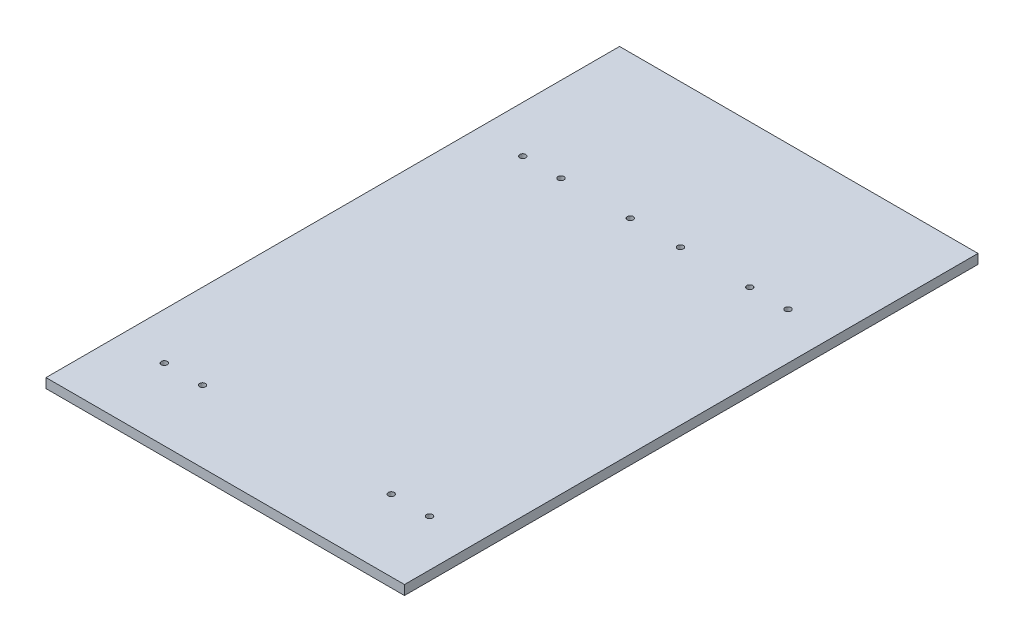
ISO-10303-21;
HEADER;
FILE_DESCRIPTION(('STEP AP214'),'2;1');
FILE_NAME('part.step','',(''),(''),'','','');
FILE_SCHEMA(('AUTOMOTIVE_DESIGN { 1 0 10303 214 1 1 1 1 }'));
ENDSEC;
DATA;
#1=APPLICATION_CONTEXT('core data for automotive mechanical design processes');
#2=APPLICATION_PROTOCOL_DEFINITION('international standard','automotive_design',2000,#1);
#3=PRODUCT_CONTEXT('',#1,'mechanical');
#4=PRODUCT('Part','Part','',(#3));
#5=PRODUCT_RELATED_PRODUCT_CATEGORY('part','',(#4));
#6=PRODUCT_DEFINITION_FORMATION('','',#4);
#7=PRODUCT_DEFINITION_CONTEXT('part definition',#1,'design');
#8=PRODUCT_DEFINITION('design','',#6,#7);
#9=PRODUCT_DEFINITION_SHAPE('','',#8);
#10=(LENGTH_UNIT() NAMED_UNIT(*) SI_UNIT(.MILLI.,.METRE.));
#11=(NAMED_UNIT(*) PLANE_ANGLE_UNIT() SI_UNIT($,.RADIAN.));
#12=(NAMED_UNIT(*) SI_UNIT($,.STERADIAN.) SOLID_ANGLE_UNIT());
#13=UNCERTAINTY_MEASURE_WITH_UNIT(LENGTH_MEASURE(1.E-05),#10,'distance_accuracy_value','');
#14=(GEOMETRIC_REPRESENTATION_CONTEXT(3) GLOBAL_UNCERTAINTY_ASSIGNED_CONTEXT((#13)) GLOBAL_UNIT_ASSIGNED_CONTEXT((#10,
#11,#12)) REPRESENTATION_CONTEXT('',''));
#15=CARTESIAN_POINT('',(0.,0.,0.));
#16=DIRECTION('',(0.,0.,1.));
#17=DIRECTION('',(1.,0.,0.));
#18=AXIS2_PLACEMENT_3D('',#15,#16,#17);
#19=CARTESIAN_POINT('',(0.,8.,0.));
#20=DIRECTION('',(0.,-1.,0.));
#21=DIRECTION('',(0.,0.,-1.));
#22=AXIS2_PLACEMENT_3D('',#19,#20,#21);
#23=PLANE('',#22);
#24=DIRECTION('',(0.,0.,-1.));
#25=VECTOR('',#24,1.);
#26=CARTESIAN_POINT('',(150.,8.,240.));
#27=LINE('',#26,#25);
#28=CARTESIAN_POINT('',(150.,8.,240.));
#29=VERTEX_POINT('',#28);
#30=CARTESIAN_POINT('',(150.,8.,-240.));
#31=VERTEX_POINT('',#30);
#32=EDGE_CURVE('E89',#29,#31,#27,.T.);
#33=ORIENTED_EDGE('',*,*,#32,.T.);
#34=DIRECTION('',(-1.,0.,0.));
#35=VECTOR('',#34,1.);
#36=CARTESIAN_POINT('',(-150.,8.,-240.));
#37=LINE('',#36,#35);
#38=CARTESIAN_POINT('',(-150.,8.,-240.));
#39=VERTEX_POINT('',#38);
#40=EDGE_CURVE('E84',#31,#39,#37,.T.);
#41=ORIENTED_EDGE('',*,*,#40,.T.);
#42=DIRECTION('',(0.,0.,1.));
#43=VECTOR('',#42,1.);
#44=CARTESIAN_POINT('',(-150.,8.,240.));
#45=LINE('',#44,#43);
#46=CARTESIAN_POINT('',(-150.,8.,240.));
#47=VERTEX_POINT('',#46);
#48=EDGE_CURVE('E87',#39,#47,#45,.T.);
#49=ORIENTED_EDGE('',*,*,#48,.T.);
#50=DIRECTION('',(1.,0.,0.));
#51=VECTOR('',#50,1.);
#52=CARTESIAN_POINT('',(-150.,8.,240.));
#53=LINE('',#52,#51);
#54=EDGE_CURVE('E54',#47,#29,#53,.T.);
#55=ORIENTED_EDGE('',*,*,#54,.T.);
#56=EDGE_LOOP('',(#33,#41,#49,#55));
#57=FACE_BOUND('',#56,.T.);
#58=CARTESIAN_POINT('',(-111.,8.,-120.));
#59=DIRECTION('',(0.,1.,0.));
#60=DIRECTION('',(0.,0.,1.));
#61=AXIS2_PLACEMENT_3D('',#58,#59,#60);
#62=CIRCLE('',#61,2.5);
#63=CARTESIAN_POINT('',(-111.,8.,-117.5));
#64=VERTEX_POINT('',#63);
#65=EDGE_CURVE('E104',#64,#64,#62,.T.);
#66=ORIENTED_EDGE('',*,*,#65,.F.);
#67=EDGE_LOOP('',(#66));
#68=FACE_BOUND('',#67,.T.);
#69=CARTESIAN_POINT('',(-111.,8.,180.));
#70=DIRECTION('',(0.,1.,0.));
#71=DIRECTION('',(0.,0.,1.));
#72=AXIS2_PLACEMENT_3D('',#69,#70,#71);
#73=CIRCLE('',#72,2.50000000000001);
#74=CARTESIAN_POINT('',(-111.,8.,182.5));
#75=VERTEX_POINT('',#74);
#76=EDGE_CURVE('E119',#75,#75,#73,.T.);
#77=ORIENTED_EDGE('',*,*,#76,.F.);
#78=EDGE_LOOP('',(#77));
#79=FACE_BOUND('',#78,.T.);
#80=CARTESIAN_POINT('',(-79.,8.,180.));
#81=DIRECTION('',(0.,1.,0.));
#82=DIRECTION('',(0.,0.,-1.));
#83=AXIS2_PLACEMENT_3D('',#80,#81,#82);
#84=CIRCLE('',#83,2.5);
#85=CARTESIAN_POINT('',(-79.,8.,177.5));
#86=VERTEX_POINT('',#85);
#87=EDGE_CURVE('E125',#86,#86,#84,.T.);
#88=ORIENTED_EDGE('',*,*,#87,.F.);
#89=EDGE_LOOP('',(#88));
#90=FACE_BOUND('',#89,.T.);
#91=CARTESIAN_POINT('',(-79.,8.,-120.));
#92=DIRECTION('',(0.,1.,0.));
#93=DIRECTION('',(0.,0.,-1.));
#94=AXIS2_PLACEMENT_3D('',#91,#92,#93);
#95=CIRCLE('',#94,2.5);
#96=CARTESIAN_POINT('',(-79.,8.,-122.5));
#97=VERTEX_POINT('',#96);
#98=EDGE_CURVE('E131',#97,#97,#95,.T.);
#99=ORIENTED_EDGE('',*,*,#98,.F.);
#100=EDGE_LOOP('',(#99));
#101=FACE_BOUND('',#100,.T.);
#102=CARTESIAN_POINT('',(79.0000000000001,8.,180.));
#103=DIRECTION('',(0.,1.,0.));
#104=DIRECTION('',(0.,0.,1.));
#105=AXIS2_PLACEMENT_3D('',#102,#103,#104);
#106=CIRCLE('',#105,2.5);
#107=CARTESIAN_POINT('',(79.0000000000001,8.,182.5));
#108=VERTEX_POINT('',#107);
#109=EDGE_CURVE('E137',#108,#108,#106,.T.);
#110=ORIENTED_EDGE('',*,*,#109,.F.);
#111=EDGE_LOOP('',(#110));
#112=FACE_BOUND('',#111,.T.);
#113=CARTESIAN_POINT('',(111.,8.,180.));
#114=DIRECTION('',(0.,1.,0.));
#115=DIRECTION('',(0.,0.,-1.));
#116=AXIS2_PLACEMENT_3D('',#113,#114,#115);
#117=CIRCLE('',#116,2.50000000000001);
#118=CARTESIAN_POINT('',(111.,8.,177.5));
#119=VERTEX_POINT('',#118);
#120=EDGE_CURVE('E143',#119,#119,#117,.T.);
#121=ORIENTED_EDGE('',*,*,#120,.F.);
#122=EDGE_LOOP('',(#121));
#123=FACE_BOUND('',#122,.T.);
#124=CARTESIAN_POINT('',(79.,8.,-120.));
#125=DIRECTION('',(0.,1.,0.));
#126=DIRECTION('',(0.,0.,1.));
#127=AXIS2_PLACEMENT_3D('',#124,#125,#126);
#128=CIRCLE('',#127,2.5);
#129=CARTESIAN_POINT('',(79.,8.,-117.5));
#130=VERTEX_POINT('',#129);
#131=EDGE_CURVE('E149',#130,#130,#128,.T.);
#132=ORIENTED_EDGE('',*,*,#131,.F.);
#133=EDGE_LOOP('',(#132));
#134=FACE_BOUND('',#133,.T.);
#135=CARTESIAN_POINT('',(111.,8.,-120.));
#136=DIRECTION('',(0.,1.,0.));
#137=DIRECTION('',(0.,0.,-1.));
#138=AXIS2_PLACEMENT_3D('',#135,#136,#137);
#139=CIRCLE('',#138,2.5);
#140=CARTESIAN_POINT('',(111.,8.,-122.5));
#141=VERTEX_POINT('',#140);
#142=EDGE_CURVE('E155',#141,#141,#139,.T.);
#143=ORIENTED_EDGE('',*,*,#142,.F.);
#144=EDGE_LOOP('',(#143));
#145=FACE_BOUND('',#144,.T.);
#146=CARTESIAN_POINT('',(-21.,8.,-120.));
#147=DIRECTION('',(0.,1.,0.));
#148=DIRECTION('',(0.,0.,1.));
#149=AXIS2_PLACEMENT_3D('',#146,#147,#148);
#150=CIRCLE('',#149,2.5);
#151=CARTESIAN_POINT('',(-21.,8.,-117.5));
#152=VERTEX_POINT('',#151);
#153=EDGE_CURVE('E161',#152,#152,#150,.T.);
#154=ORIENTED_EDGE('',*,*,#153,.F.);
#155=EDGE_LOOP('',(#154));
#156=FACE_BOUND('',#155,.T.);
#157=CARTESIAN_POINT('',(21.,8.,-120.));
#158=DIRECTION('',(0.,1.,0.));
#159=DIRECTION('',(0.,0.,-1.));
#160=AXIS2_PLACEMENT_3D('',#157,#158,#159);
#161=CIRCLE('',#160,2.5);
#162=CARTESIAN_POINT('',(21.,8.,-122.5));
#163=VERTEX_POINT('',#162);
#164=EDGE_CURVE('E167',#163,#163,#161,.T.);
#165=ORIENTED_EDGE('',*,*,#164,.F.);
#166=EDGE_LOOP('',(#165));
#167=FACE_BOUND('',#166,.T.);
#168=ADVANCED_FACE('F37',(#57,#68,#79,#90,#101,#112,#123,#134,#145,#156,#167),#23,.F.);
#169=CARTESIAN_POINT('',(0.,0.,0.));
#170=DIRECTION('',(0.,-1.,0.));
#171=DIRECTION('',(0.,0.,-1.));
#172=AXIS2_PLACEMENT_3D('',#169,#170,#171);
#173=PLANE('',#172);
#174=CARTESIAN_POINT('',(-21.,0.,-120.));
#175=DIRECTION('',(0.,1.,0.));
#176=DIRECTION('',(0.,0.,1.));
#177=AXIS2_PLACEMENT_3D('',#174,#175,#176);
#178=CIRCLE('',#177,2.5);
#179=CARTESIAN_POINT('',(-21.,0.,-117.5));
#180=VERTEX_POINT('',#179);
#181=EDGE_CURVE('E164',#180,#180,#178,.T.);
#182=ORIENTED_EDGE('',*,*,#181,.T.);
#183=EDGE_LOOP('',(#182));
#184=FACE_BOUND('',#183,.T.);
#185=CARTESIAN_POINT('',(79.,0.,-120.));
#186=DIRECTION('',(0.,1.,0.));
#187=DIRECTION('',(0.,0.,1.));
#188=AXIS2_PLACEMENT_3D('',#185,#186,#187);
#189=CIRCLE('',#188,2.5);
#190=CARTESIAN_POINT('',(79.,0.,-117.5));
#191=VERTEX_POINT('',#190);
#192=EDGE_CURVE('E152',#191,#191,#189,.T.);
#193=ORIENTED_EDGE('',*,*,#192,.T.);
#194=EDGE_LOOP('',(#193));
#195=FACE_BOUND('',#194,.T.);
#196=CARTESIAN_POINT('',(79.0000000000001,0.,180.));
#197=DIRECTION('',(0.,1.,0.));
#198=DIRECTION('',(0.,0.,1.));
#199=AXIS2_PLACEMENT_3D('',#196,#197,#198);
#200=CIRCLE('',#199,2.5);
#201=CARTESIAN_POINT('',(79.0000000000001,0.,182.5));
#202=VERTEX_POINT('',#201);
#203=EDGE_CURVE('E140',#202,#202,#200,.T.);
#204=ORIENTED_EDGE('',*,*,#203,.T.);
#205=EDGE_LOOP('',(#204));
#206=FACE_BOUND('',#205,.T.);
#207=CARTESIAN_POINT('',(-79.,0.,180.));
#208=DIRECTION('',(0.,1.,0.));
#209=DIRECTION('',(0.,0.,-1.));
#210=AXIS2_PLACEMENT_3D('',#207,#208,#209);
#211=CIRCLE('',#210,2.5);
#212=CARTESIAN_POINT('',(-79.,0.,177.5));
#213=VERTEX_POINT('',#212);
#214=EDGE_CURVE('E128',#213,#213,#211,.T.);
#215=ORIENTED_EDGE('',*,*,#214,.T.);
#216=EDGE_LOOP('',(#215));
#217=FACE_BOUND('',#216,.T.);
#218=CARTESIAN_POINT('',(-111.,0.,-120.));
#219=DIRECTION('',(0.,1.,0.));
#220=DIRECTION('',(0.,0.,1.));
#221=AXIS2_PLACEMENT_3D('',#218,#219,#220);
#222=CIRCLE('',#221,2.5);
#223=CARTESIAN_POINT('',(-111.,0.,-117.5));
#224=VERTEX_POINT('',#223);
#225=EDGE_CURVE('E116',#224,#224,#222,.T.);
#226=ORIENTED_EDGE('',*,*,#225,.T.);
#227=EDGE_LOOP('',(#226));
#228=FACE_BOUND('',#227,.T.);
#229=DIRECTION('',(0.,0.,-1.));
#230=VECTOR('',#229,1.);
#231=CARTESIAN_POINT('',(150.,0.,240.));
#232=LINE('',#231,#230);
#233=CARTESIAN_POINT('',(150.,0.,240.));
#234=VERTEX_POINT('',#233);
#235=CARTESIAN_POINT('',(150.,0.,-240.));
#236=VERTEX_POINT('',#235);
#237=EDGE_CURVE('E101',#234,#236,#232,.T.);
#238=ORIENTED_EDGE('',*,*,#237,.F.);
#239=DIRECTION('',(1.,0.,0.));
#240=VECTOR('',#239,1.);
#241=CARTESIAN_POINT('',(-150.,0.,240.));
#242=LINE('',#241,#240);
#243=CARTESIAN_POINT('',(-150.,0.,240.));
#244=VERTEX_POINT('',#243);
#245=EDGE_CURVE('E77',#244,#234,#242,.T.);
#246=ORIENTED_EDGE('',*,*,#245,.F.);
#247=DIRECTION('',(0.,0.,1.));
#248=VECTOR('',#247,1.);
#249=CARTESIAN_POINT('',(-150.,0.,240.));
#250=LINE('',#249,#248);
#251=CARTESIAN_POINT('',(-150.,0.,-240.));
#252=VERTEX_POINT('',#251);
#253=EDGE_CURVE('E71',#252,#244,#250,.T.);
#254=ORIENTED_EDGE('',*,*,#253,.F.);
#255=DIRECTION('',(-1.,0.,0.));
#256=VECTOR('',#255,1.);
#257=CARTESIAN_POINT('',(-150.,0.,-240.));
#258=LINE('',#257,#256);
#259=EDGE_CURVE('E93',#236,#252,#258,.T.);
#260=ORIENTED_EDGE('',*,*,#259,.F.);
#261=EDGE_LOOP('',(#238,#246,#254,#260));
#262=FACE_BOUND('',#261,.T.);
#263=CARTESIAN_POINT('',(-111.,0.,180.));
#264=DIRECTION('',(0.,1.,0.));
#265=DIRECTION('',(0.,0.,1.));
#266=AXIS2_PLACEMENT_3D('',#263,#264,#265);
#267=CIRCLE('',#266,2.50000000000001);
#268=CARTESIAN_POINT('',(-111.,0.,182.5));
#269=VERTEX_POINT('',#268);
#270=EDGE_CURVE('E122',#269,#269,#267,.T.);
#271=ORIENTED_EDGE('',*,*,#270,.T.);
#272=EDGE_LOOP('',(#271));
#273=FACE_BOUND('',#272,.T.);
#274=CARTESIAN_POINT('',(-79.,0.,-120.));
#275=DIRECTION('',(0.,1.,0.));
#276=DIRECTION('',(0.,0.,-1.));
#277=AXIS2_PLACEMENT_3D('',#274,#275,#276);
#278=CIRCLE('',#277,2.5);
#279=CARTESIAN_POINT('',(-79.,0.,-122.5));
#280=VERTEX_POINT('',#279);
#281=EDGE_CURVE('E134',#280,#280,#278,.T.);
#282=ORIENTED_EDGE('',*,*,#281,.T.);
#283=EDGE_LOOP('',(#282));
#284=FACE_BOUND('',#283,.T.);
#285=CARTESIAN_POINT('',(111.,0.,180.));
#286=DIRECTION('',(0.,1.,0.));
#287=DIRECTION('',(0.,0.,-1.));
#288=AXIS2_PLACEMENT_3D('',#285,#286,#287);
#289=CIRCLE('',#288,2.50000000000001);
#290=CARTESIAN_POINT('',(111.,0.,177.5));
#291=VERTEX_POINT('',#290);
#292=EDGE_CURVE('E146',#291,#291,#289,.T.);
#293=ORIENTED_EDGE('',*,*,#292,.T.);
#294=EDGE_LOOP('',(#293));
#295=FACE_BOUND('',#294,.T.);
#296=CARTESIAN_POINT('',(111.,0.,-120.));
#297=DIRECTION('',(0.,1.,0.));
#298=DIRECTION('',(0.,0.,-1.));
#299=AXIS2_PLACEMENT_3D('',#296,#297,#298);
#300=CIRCLE('',#299,2.5);
#301=CARTESIAN_POINT('',(111.,0.,-122.5));
#302=VERTEX_POINT('',#301);
#303=EDGE_CURVE('E158',#302,#302,#300,.T.);
#304=ORIENTED_EDGE('',*,*,#303,.T.);
#305=EDGE_LOOP('',(#304));
#306=FACE_BOUND('',#305,.T.);
#307=CARTESIAN_POINT('',(21.,0.,-120.));
#308=DIRECTION('',(0.,1.,0.));
#309=DIRECTION('',(0.,0.,-1.));
#310=AXIS2_PLACEMENT_3D('',#307,#308,#309);
#311=CIRCLE('',#310,2.5);
#312=CARTESIAN_POINT('',(21.,0.,-122.5));
#313=VERTEX_POINT('',#312);
#314=EDGE_CURVE('E170',#313,#313,#311,.T.);
#315=ORIENTED_EDGE('',*,*,#314,.T.);
#316=EDGE_LOOP('',(#315));
#317=FACE_BOUND('',#316,.T.);
#318=ADVANCED_FACE('F112',(#184,#195,#206,#217,#228,#262,#273,#284,#295,#306,#317),#173,.T.);
#319=CARTESIAN_POINT('',(150.,8.,240.));
#320=DIRECTION('',(-1.,0.,0.));
#321=DIRECTION('',(0.,0.,1.));
#322=AXIS2_PLACEMENT_3D('',#319,#320,#321);
#323=PLANE('',#322);
#324=ORIENTED_EDGE('',*,*,#237,.T.);
#325=DIRECTION('',(0.,-1.,0.));
#326=VECTOR('',#325,1.);
#327=CARTESIAN_POINT('',(150.,8.,-240.));
#328=LINE('',#327,#326);
#329=EDGE_CURVE('E11',#31,#236,#328,.T.);
#330=ORIENTED_EDGE('',*,*,#329,.F.);
#331=ORIENTED_EDGE('',*,*,#32,.F.);
#332=DIRECTION('',(0.,-1.,0.));
#333=VECTOR('',#332,1.);
#334=CARTESIAN_POINT('',(150.,8.,240.));
#335=LINE('',#334,#333);
#336=EDGE_CURVE('E97',#29,#234,#335,.T.);
#337=ORIENTED_EDGE('',*,*,#336,.T.);
#338=EDGE_LOOP('',(#324,#330,#331,#337));
#339=FACE_BOUND('',#338,.T.);
#340=ADVANCED_FACE('F39',(#339),#323,.F.);
#341=CARTESIAN_POINT('',(-150.,8.,-240.));
#342=DIRECTION('',(0.,0.,1.));
#343=DIRECTION('',(1.,0.,0.));
#344=AXIS2_PLACEMENT_3D('',#341,#342,#343);
#345=PLANE('',#344);
#346=ORIENTED_EDGE('',*,*,#259,.T.);
#347=DIRECTION('',(0.,-1.,0.));
#348=VECTOR('',#347,1.);
#349=CARTESIAN_POINT('',(-150.,8.,-240.));
#350=LINE('',#349,#348);
#351=EDGE_CURVE('E46',#39,#252,#350,.T.);
#352=ORIENTED_EDGE('',*,*,#351,.F.);
#353=ORIENTED_EDGE('',*,*,#40,.F.);
#354=ORIENTED_EDGE('',*,*,#329,.T.);
#355=EDGE_LOOP('',(#346,#352,#353,#354));
#356=FACE_BOUND('',#355,.T.);
#357=ADVANCED_FACE('F92',(#356),#345,.F.);
#358=CARTESIAN_POINT('',(-150.,8.,240.));
#359=DIRECTION('',(1.,0.,0.));
#360=DIRECTION('',(0.,0.,-1.));
#361=AXIS2_PLACEMENT_3D('',#358,#359,#360);
#362=PLANE('',#361);
#363=ORIENTED_EDGE('',*,*,#253,.T.);
#364=DIRECTION('',(0.,-1.,0.));
#365=VECTOR('',#364,1.);
#366=CARTESIAN_POINT('',(-150.,8.,240.));
#367=LINE('',#366,#365);
#368=EDGE_CURVE('E94',#47,#244,#367,.T.);
#369=ORIENTED_EDGE('',*,*,#368,.F.);
#370=ORIENTED_EDGE('',*,*,#48,.F.);
#371=ORIENTED_EDGE('',*,*,#351,.T.);
#372=EDGE_LOOP('',(#363,#369,#370,#371));
#373=FACE_BOUND('',#372,.T.);
#374=ADVANCED_FACE('F95',(#373),#362,.F.);
#375=CARTESIAN_POINT('',(-150.,8.,240.));
#376=DIRECTION('',(0.,0.,-1.));
#377=DIRECTION('',(-1.,0.,0.));
#378=AXIS2_PLACEMENT_3D('',#375,#376,#377);
#379=PLANE('',#378);
#380=ORIENTED_EDGE('',*,*,#245,.T.);
#381=ORIENTED_EDGE('',*,*,#336,.F.);
#382=ORIENTED_EDGE('',*,*,#54,.F.);
#383=ORIENTED_EDGE('',*,*,#368,.T.);
#384=EDGE_LOOP('',(#380,#381,#382,#383));
#385=FACE_BOUND('',#384,.T.);
#386=ADVANCED_FACE('F109',(#385),#379,.F.);
#387=CARTESIAN_POINT('',(-111.,8.,-120.));
#388=DIRECTION('',(0.,-1.,0.));
#389=DIRECTION('',(0.,0.,-1.));
#390=AXIS2_PLACEMENT_3D('',#387,#388,#389);
#391=CYLINDRICAL_SURFACE('',#390,2.5);
#392=ORIENTED_EDGE('',*,*,#65,.T.);
#393=EDGE_LOOP('',(#392));
#394=FACE_BOUND('',#393,.T.);
#395=ORIENTED_EDGE('',*,*,#225,.F.);
#396=EDGE_LOOP('',(#395));
#397=FACE_BOUND('',#396,.T.);
#398=ADVANCED_FACE('F187',(#394,#397),#391,.F.);
#399=CARTESIAN_POINT('',(-111.,8.,180.));
#400=DIRECTION('',(0.,-1.,0.));
#401=DIRECTION('',(0.,0.,-1.));
#402=AXIS2_PLACEMENT_3D('',#399,#400,#401);
#403=CYLINDRICAL_SURFACE('',#402,2.50000000000001);
#404=ORIENTED_EDGE('',*,*,#76,.T.);
#405=EDGE_LOOP('',(#404));
#406=FACE_BOUND('',#405,.T.);
#407=ORIENTED_EDGE('',*,*,#270,.F.);
#408=EDGE_LOOP('',(#407));
#409=FACE_BOUND('',#408,.T.);
#410=ADVANCED_FACE('F241',(#406,#409),#403,.F.);
#411=CARTESIAN_POINT('',(-79.,8.,180.));
#412=DIRECTION('',(0.,-1.,0.));
#413=DIRECTION('',(0.,0.,-1.));
#414=AXIS2_PLACEMENT_3D('',#411,#412,#413);
#415=CYLINDRICAL_SURFACE('',#414,2.5);
#416=ORIENTED_EDGE('',*,*,#87,.T.);
#417=EDGE_LOOP('',(#416));
#418=FACE_BOUND('',#417,.T.);
#419=ORIENTED_EDGE('',*,*,#214,.F.);
#420=EDGE_LOOP('',(#419));
#421=FACE_BOUND('',#420,.T.);
#422=ADVANCED_FACE('F250',(#418,#421),#415,.F.);
#423=CARTESIAN_POINT('',(-79.,8.,-120.));
#424=DIRECTION('',(0.,-1.,0.));
#425=DIRECTION('',(0.,0.,-1.));
#426=AXIS2_PLACEMENT_3D('',#423,#424,#425);
#427=CYLINDRICAL_SURFACE('',#426,2.5);
#428=ORIENTED_EDGE('',*,*,#98,.T.);
#429=EDGE_LOOP('',(#428));
#430=FACE_BOUND('',#429,.T.);
#431=ORIENTED_EDGE('',*,*,#281,.F.);
#432=EDGE_LOOP('',(#431));
#433=FACE_BOUND('',#432,.T.);
#434=ADVANCED_FACE('F259',(#430,#433),#427,.F.);
#435=CARTESIAN_POINT('',(79.0000000000001,8.,180.));
#436=DIRECTION('',(0.,-1.,0.));
#437=DIRECTION('',(0.,0.,-1.));
#438=AXIS2_PLACEMENT_3D('',#435,#436,#437);
#439=CYLINDRICAL_SURFACE('',#438,2.5);
#440=ORIENTED_EDGE('',*,*,#109,.T.);
#441=EDGE_LOOP('',(#440));
#442=FACE_BOUND('',#441,.T.);
#443=ORIENTED_EDGE('',*,*,#203,.F.);
#444=EDGE_LOOP('',(#443));
#445=FACE_BOUND('',#444,.T.);
#446=ADVANCED_FACE('F269',(#442,#445),#439,.F.);
#447=CARTESIAN_POINT('',(111.,8.,180.));
#448=DIRECTION('',(0.,-1.,0.));
#449=DIRECTION('',(0.,0.,-1.));
#450=AXIS2_PLACEMENT_3D('',#447,#448,#449);
#451=CYLINDRICAL_SURFACE('',#450,2.50000000000001);
#452=ORIENTED_EDGE('',*,*,#120,.T.);
#453=EDGE_LOOP('',(#452));
#454=FACE_BOUND('',#453,.T.);
#455=ORIENTED_EDGE('',*,*,#292,.F.);
#456=EDGE_LOOP('',(#455));
#457=FACE_BOUND('',#456,.T.);
#458=ADVANCED_FACE('F279',(#454,#457),#451,.F.);
#459=CARTESIAN_POINT('',(79.,8.,-120.));
#460=DIRECTION('',(0.,-1.,0.));
#461=DIRECTION('',(0.,0.,-1.));
#462=AXIS2_PLACEMENT_3D('',#459,#460,#461);
#463=CYLINDRICAL_SURFACE('',#462,2.5);
#464=ORIENTED_EDGE('',*,*,#131,.T.);
#465=EDGE_LOOP('',(#464));
#466=FACE_BOUND('',#465,.T.);
#467=ORIENTED_EDGE('',*,*,#192,.F.);
#468=EDGE_LOOP('',(#467));
#469=FACE_BOUND('',#468,.T.);
#470=ADVANCED_FACE('F289',(#466,#469),#463,.F.);
#471=CARTESIAN_POINT('',(111.,8.,-120.));
#472=DIRECTION('',(0.,-1.,0.));
#473=DIRECTION('',(0.,0.,-1.));
#474=AXIS2_PLACEMENT_3D('',#471,#472,#473);
#475=CYLINDRICAL_SURFACE('',#474,2.5);
#476=ORIENTED_EDGE('',*,*,#142,.T.);
#477=EDGE_LOOP('',(#476));
#478=FACE_BOUND('',#477,.T.);
#479=ORIENTED_EDGE('',*,*,#303,.F.);
#480=EDGE_LOOP('',(#479));
#481=FACE_BOUND('',#480,.T.);
#482=ADVANCED_FACE('F299',(#478,#481),#475,.F.);
#483=CARTESIAN_POINT('',(-21.,8.,-120.));
#484=DIRECTION('',(0.,-1.,0.));
#485=DIRECTION('',(0.,0.,-1.));
#486=AXIS2_PLACEMENT_3D('',#483,#484,#485);
#487=CYLINDRICAL_SURFACE('',#486,2.5);
#488=ORIENTED_EDGE('',*,*,#153,.T.);
#489=EDGE_LOOP('',(#488));
#490=FACE_BOUND('',#489,.T.);
#491=ORIENTED_EDGE('',*,*,#181,.F.);
#492=EDGE_LOOP('',(#491));
#493=FACE_BOUND('',#492,.T.);
#494=ADVANCED_FACE('F309',(#490,#493),#487,.F.);
#495=CARTESIAN_POINT('',(21.,8.,-120.));
#496=DIRECTION('',(0.,-1.,0.));
#497=DIRECTION('',(0.,0.,-1.));
#498=AXIS2_PLACEMENT_3D('',#495,#496,#497);
#499=CYLINDRICAL_SURFACE('',#498,2.5);
#500=ORIENTED_EDGE('',*,*,#164,.T.);
#501=EDGE_LOOP('',(#500));
#502=FACE_BOUND('',#501,.T.);
#503=ORIENTED_EDGE('',*,*,#314,.F.);
#504=EDGE_LOOP('',(#503));
#505=FACE_BOUND('',#504,.T.);
#506=ADVANCED_FACE('F176',(#502,#505),#499,.F.);
#507=CLOSED_SHELL('',(#168,#318,#340,#357,#374,#386,#398,#410,#422,#434,#446,#458,#470,#482,
#494,#506));
#508=MANIFOLD_SOLID_BREP('B2',#507);
#509=ADVANCED_BREP_SHAPE_REPRESENTATION('',(#18,#508),#14);
#510=SHAPE_DEFINITION_REPRESENTATION(#9,#509);
ENDSEC;
END-ISO-10303-21;
